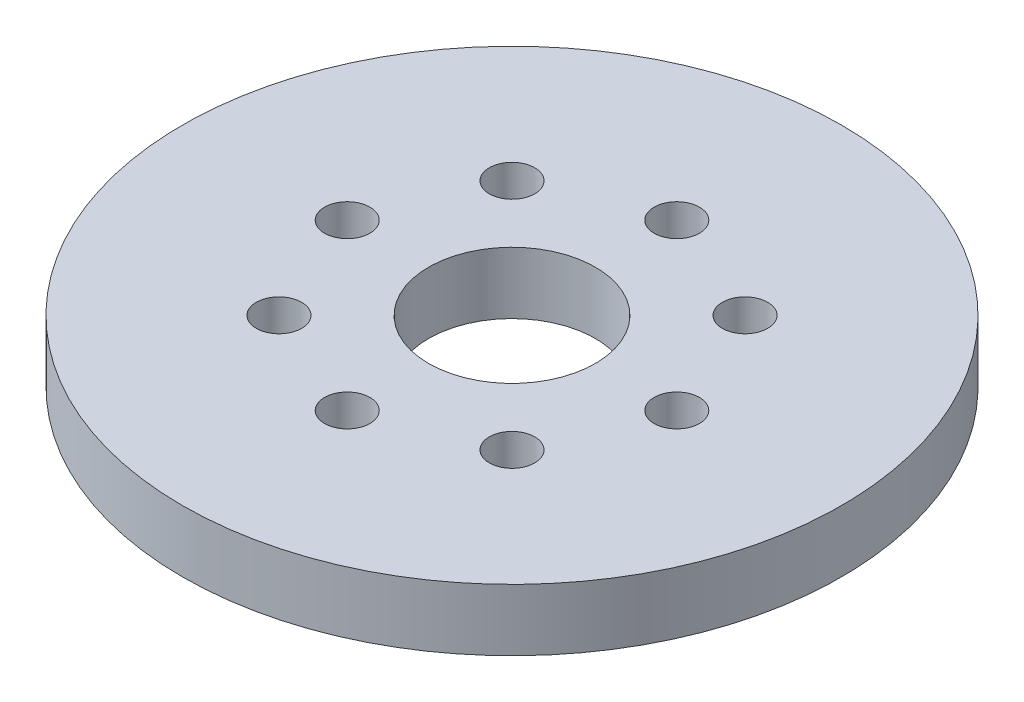
ISO-10303-21;
HEADER;
FILE_DESCRIPTION(('STEP AP214'),'2;1');
FILE_NAME('part.step','',(''),(''),'','','');
FILE_SCHEMA(('AUTOMOTIVE_DESIGN { 1 0 10303 214 1 1 1 1 }'));
ENDSEC;
DATA;
#1=APPLICATION_CONTEXT('core data for automotive mechanical design processes');
#2=APPLICATION_PROTOCOL_DEFINITION('international standard','automotive_design',2000,#1);
#3=PRODUCT_CONTEXT('',#1,'mechanical');
#4=PRODUCT('Part','Part','',(#3));
#5=PRODUCT_RELATED_PRODUCT_CATEGORY('part','',(#4));
#6=PRODUCT_DEFINITION_FORMATION('','',#4);
#7=PRODUCT_DEFINITION_CONTEXT('part definition',#1,'design');
#8=PRODUCT_DEFINITION('design','',#6,#7);
#9=PRODUCT_DEFINITION_SHAPE('','',#8);
#10=(LENGTH_UNIT() NAMED_UNIT(*) SI_UNIT(.MILLI.,.METRE.));
#11=(NAMED_UNIT(*) PLANE_ANGLE_UNIT() SI_UNIT($,.RADIAN.));
#12=(NAMED_UNIT(*) SI_UNIT($,.STERADIAN.) SOLID_ANGLE_UNIT());
#13=UNCERTAINTY_MEASURE_WITH_UNIT(LENGTH_MEASURE(1.E-05),#10,'distance_accuracy_value','');
#14=(GEOMETRIC_REPRESENTATION_CONTEXT(3) GLOBAL_UNCERTAINTY_ASSIGNED_CONTEXT((#13)) GLOBAL_UNIT_ASSIGNED_CONTEXT((#10,
#11,#12)) REPRESENTATION_CONTEXT('',''));
#15=CARTESIAN_POINT('',(0.,0.,0.));
#16=DIRECTION('',(0.,0.,1.));
#17=DIRECTION('',(1.,0.,0.));
#18=AXIS2_PLACEMENT_3D('',#15,#16,#17);
#19=CARTESIAN_POINT('',(0.,3.,0.));
#20=DIRECTION('',(0.,1.,0.));
#21=DIRECTION('',(0.,0.,1.));
#22=AXIS2_PLACEMENT_3D('',#19,#20,#21);
#23=PLANE('',#22);
#24=CARTESIAN_POINT('',(-8.,3.,0.));
#25=DIRECTION('',(0.,1.,0.));
#26=DIRECTION('',(0.,0.,1.));
#27=AXIS2_PLACEMENT_3D('',#24,#25,#26);
#28=CIRCLE('',#27,1.1);
#29=CARTESIAN_POINT('',(-8.,3.,1.09999999999992));
#30=VERTEX_POINT('',#29);
#31=EDGE_CURVE('E82',#30,#30,#28,.T.);
#32=ORIENTED_EDGE('',*,*,#31,.F.);
#33=EDGE_LOOP('',(#32));
#34=FACE_BOUND('',#33,.T.);
#35=CARTESIAN_POINT('',(0.,3.,8.));
#36=DIRECTION('',(0.,1.,0.));
#37=DIRECTION('',(0.,0.,1.));
#38=AXIS2_PLACEMENT_3D('',#35,#36,#37);
#39=CIRCLE('',#38,1.1);
#40=CARTESIAN_POINT('',(0.,3.,9.1));
#41=VERTEX_POINT('',#40);
#42=EDGE_CURVE('E70',#41,#41,#39,.T.);
#43=ORIENTED_EDGE('',*,*,#42,.F.);
#44=EDGE_LOOP('',(#43));
#45=FACE_BOUND('',#44,.T.);
#46=CARTESIAN_POINT('',(8.,3.,0.));
#47=DIRECTION('',(0.,1.,0.));
#48=DIRECTION('',(0.,0.,1.));
#49=AXIS2_PLACEMENT_3D('',#46,#47,#48);
#50=CIRCLE('',#49,1.1);
#51=CARTESIAN_POINT('',(8.,3.,1.10000000000003));
#52=VERTEX_POINT('',#51);
#53=EDGE_CURVE('E58',#52,#52,#50,.T.);
#54=ORIENTED_EDGE('',*,*,#53,.F.);
#55=EDGE_LOOP('',(#54));
#56=FACE_BOUND('',#55,.T.);
#57=CARTESIAN_POINT('',(0.,3.,-8.));
#58=DIRECTION('',(0.,1.,0.));
#59=DIRECTION('',(0.,0.,1.));
#60=AXIS2_PLACEMENT_3D('',#57,#58,#59);
#61=CIRCLE('',#60,1.1);
#62=CARTESIAN_POINT('',(0.,3.,-6.9));
#63=VERTEX_POINT('',#62);
#64=EDGE_CURVE('E46',#63,#63,#61,.T.);
#65=ORIENTED_EDGE('',*,*,#64,.F.);
#66=EDGE_LOOP('',(#65));
#67=FACE_BOUND('',#66,.T.);
#68=CARTESIAN_POINT('',(0.,3.,0.));
#69=DIRECTION('',(0.,1.,0.));
#70=DIRECTION('',(0.,0.,1.));
#71=AXIS2_PLACEMENT_3D('',#68,#69,#70);
#72=CIRCLE('',#71,16.);
#73=CARTESIAN_POINT('',(0.,3.,16.));
#74=VERTEX_POINT('',#73);
#75=EDGE_CURVE('E10',#74,#74,#72,.T.);
#76=ORIENTED_EDGE('',*,*,#75,.T.);
#77=EDGE_LOOP('',(#76));
#78=FACE_BOUND('',#77,.T.);
#79=CARTESIAN_POINT('',(0.,3.,0.));
#80=DIRECTION('',(0.,1.,0.));
#81=DIRECTION('',(0.,0.,1.));
#82=AXIS2_PLACEMENT_3D('',#79,#80,#81);
#83=CIRCLE('',#82,4.05);
#84=CARTESIAN_POINT('',(0.,3.,4.05));
#85=VERTEX_POINT('',#84);
#86=EDGE_CURVE('E41',#85,#85,#83,.T.);
#87=ORIENTED_EDGE('',*,*,#86,.F.);
#88=EDGE_LOOP('',(#87));
#89=FACE_BOUND('',#88,.T.);
#90=CARTESIAN_POINT('',(5.65685424949239,3.,-5.65685424949237));
#91=DIRECTION('',(0.,1.,0.));
#92=DIRECTION('',(0.,0.,1.));
#93=AXIS2_PLACEMENT_3D('',#90,#91,#92);
#94=CIRCLE('',#93,1.1);
#95=CARTESIAN_POINT('',(5.65685424949239,3.,-4.55685424949237));
#96=VERTEX_POINT('',#95);
#97=EDGE_CURVE('E52',#96,#96,#94,.T.);
#98=ORIENTED_EDGE('',*,*,#97,.F.);
#99=EDGE_LOOP('',(#98));
#100=FACE_BOUND('',#99,.T.);
#101=CARTESIAN_POINT('',(5.65685424949235,3.,5.65685424949241));
#102=DIRECTION('',(0.,1.,0.));
#103=DIRECTION('',(0.,0.,1.));
#104=AXIS2_PLACEMENT_3D('',#101,#102,#103);
#105=CIRCLE('',#104,1.1);
#106=CARTESIAN_POINT('',(5.65685424949235,3.,6.75685424949241));
#107=VERTEX_POINT('',#106);
#108=EDGE_CURVE('E64',#107,#107,#105,.T.);
#109=ORIENTED_EDGE('',*,*,#108,.F.);
#110=EDGE_LOOP('',(#109));
#111=FACE_BOUND('',#110,.T.);
#112=CARTESIAN_POINT('',(-5.65685424949243,3.,5.65685424949233));
#113=DIRECTION('',(0.,1.,0.));
#114=DIRECTION('',(0.,0.,1.));
#115=AXIS2_PLACEMENT_3D('',#112,#113,#114);
#116=CIRCLE('',#115,1.1);
#117=CARTESIAN_POINT('',(-5.65685424949243,3.,6.75685424949233));
#118=VERTEX_POINT('',#117);
#119=EDGE_CURVE('E76',#118,#118,#116,.T.);
#120=ORIENTED_EDGE('',*,*,#119,.F.);
#121=EDGE_LOOP('',(#120));
#122=FACE_BOUND('',#121,.T.);
#123=CARTESIAN_POINT('',(-5.65685424949231,3.,-5.65685424949245));
#124=DIRECTION('',(0.,1.,0.));
#125=DIRECTION('',(0.,0.,1.));
#126=AXIS2_PLACEMENT_3D('',#123,#124,#125);
#127=CIRCLE('',#126,1.1);
#128=CARTESIAN_POINT('',(-5.65685424949231,3.,-4.55685424949245));
#129=VERTEX_POINT('',#128);
#130=EDGE_CURVE('E88',#129,#129,#127,.T.);
#131=ORIENTED_EDGE('',*,*,#130,.F.);
#132=EDGE_LOOP('',(#131));
#133=FACE_BOUND('',#132,.T.);
#134=ADVANCED_FACE('F30',(#34,#45,#56,#67,#78,#89,#100,#111,#122,#133),#23,.T.);
#135=CARTESIAN_POINT('',(0.,0.,0.));
#136=DIRECTION('',(0.,1.,0.));
#137=DIRECTION('',(0.,0.,1.));
#138=AXIS2_PLACEMENT_3D('',#135,#136,#137);
#139=PLANE('',#138);
#140=CARTESIAN_POINT('',(-8.,0.,0.));
#141=DIRECTION('',(0.,1.,0.));
#142=DIRECTION('',(0.,0.,1.));
#143=AXIS2_PLACEMENT_3D('',#140,#141,#142);
#144=CIRCLE('',#143,1.1);
#145=CARTESIAN_POINT('',(-8.,0.,1.09999999999992));
#146=VERTEX_POINT('',#145);
#147=EDGE_CURVE('E85',#146,#146,#144,.T.);
#148=ORIENTED_EDGE('',*,*,#147,.T.);
#149=EDGE_LOOP('',(#148));
#150=FACE_BOUND('',#149,.T.);
#151=CARTESIAN_POINT('',(0.,0.,8.));
#152=DIRECTION('',(0.,1.,0.));
#153=DIRECTION('',(0.,0.,1.));
#154=AXIS2_PLACEMENT_3D('',#151,#152,#153);
#155=CIRCLE('',#154,1.1);
#156=CARTESIAN_POINT('',(0.,0.,9.1));
#157=VERTEX_POINT('',#156);
#158=EDGE_CURVE('E73',#157,#157,#155,.T.);
#159=ORIENTED_EDGE('',*,*,#158,.T.);
#160=EDGE_LOOP('',(#159));
#161=FACE_BOUND('',#160,.T.);
#162=CARTESIAN_POINT('',(8.,0.,0.));
#163=DIRECTION('',(0.,1.,0.));
#164=DIRECTION('',(0.,0.,1.));
#165=AXIS2_PLACEMENT_3D('',#162,#163,#164);
#166=CIRCLE('',#165,1.1);
#167=CARTESIAN_POINT('',(8.,0.,1.10000000000003));
#168=VERTEX_POINT('',#167);
#169=EDGE_CURVE('E61',#168,#168,#166,.T.);
#170=ORIENTED_EDGE('',*,*,#169,.T.);
#171=EDGE_LOOP('',(#170));
#172=FACE_BOUND('',#171,.T.);
#173=CARTESIAN_POINT('',(0.,0.,-8.));
#174=DIRECTION('',(0.,1.,0.));
#175=DIRECTION('',(0.,0.,1.));
#176=AXIS2_PLACEMENT_3D('',#173,#174,#175);
#177=CIRCLE('',#176,1.1);
#178=CARTESIAN_POINT('',(0.,0.,-6.9));
#179=VERTEX_POINT('',#178);
#180=EDGE_CURVE('E49',#179,#179,#177,.T.);
#181=ORIENTED_EDGE('',*,*,#180,.T.);
#182=EDGE_LOOP('',(#181));
#183=FACE_BOUND('',#182,.T.);
#184=CARTESIAN_POINT('',(0.,0.,0.));
#185=DIRECTION('',(0.,1.,0.));
#186=DIRECTION('',(0.,0.,1.));
#187=AXIS2_PLACEMENT_3D('',#184,#185,#186);
#188=CIRCLE('',#187,16.);
#189=CARTESIAN_POINT('',(0.,0.,16.));
#190=VERTEX_POINT('',#189);
#191=EDGE_CURVE('E34',#190,#190,#188,.T.);
#192=ORIENTED_EDGE('',*,*,#191,.F.);
#193=EDGE_LOOP('',(#192));
#194=FACE_BOUND('',#193,.T.);
#195=CARTESIAN_POINT('',(0.,0.,0.));
#196=DIRECTION('',(0.,1.,0.));
#197=DIRECTION('',(0.,0.,1.));
#198=AXIS2_PLACEMENT_3D('',#195,#196,#197);
#199=CIRCLE('',#198,4.05);
#200=CARTESIAN_POINT('',(0.,0.,4.05));
#201=VERTEX_POINT('',#200);
#202=EDGE_CURVE('E43',#201,#201,#199,.T.);
#203=ORIENTED_EDGE('',*,*,#202,.T.);
#204=EDGE_LOOP('',(#203));
#205=FACE_BOUND('',#204,.T.);
#206=CARTESIAN_POINT('',(5.65685424949239,0.,-5.65685424949237));
#207=DIRECTION('',(0.,1.,0.));
#208=DIRECTION('',(0.,0.,1.));
#209=AXIS2_PLACEMENT_3D('',#206,#207,#208);
#210=CIRCLE('',#209,1.1);
#211=CARTESIAN_POINT('',(5.65685424949239,0.,-4.55685424949237));
#212=VERTEX_POINT('',#211);
#213=EDGE_CURVE('E55',#212,#212,#210,.T.);
#214=ORIENTED_EDGE('',*,*,#213,.T.);
#215=EDGE_LOOP('',(#214));
#216=FACE_BOUND('',#215,.T.);
#217=CARTESIAN_POINT('',(5.65685424949235,0.,5.65685424949241));
#218=DIRECTION('',(0.,1.,0.));
#219=DIRECTION('',(0.,0.,1.));
#220=AXIS2_PLACEMENT_3D('',#217,#218,#219);
#221=CIRCLE('',#220,1.1);
#222=CARTESIAN_POINT('',(5.65685424949235,0.,6.75685424949241));
#223=VERTEX_POINT('',#222);
#224=EDGE_CURVE('E67',#223,#223,#221,.T.);
#225=ORIENTED_EDGE('',*,*,#224,.T.);
#226=EDGE_LOOP('',(#225));
#227=FACE_BOUND('',#226,.T.);
#228=CARTESIAN_POINT('',(-5.65685424949243,0.,5.65685424949233));
#229=DIRECTION('',(0.,1.,0.));
#230=DIRECTION('',(0.,0.,1.));
#231=AXIS2_PLACEMENT_3D('',#228,#229,#230);
#232=CIRCLE('',#231,1.1);
#233=CARTESIAN_POINT('',(-5.65685424949243,0.,6.75685424949233));
#234=VERTEX_POINT('',#233);
#235=EDGE_CURVE('E79',#234,#234,#232,.T.);
#236=ORIENTED_EDGE('',*,*,#235,.T.);
#237=EDGE_LOOP('',(#236));
#238=FACE_BOUND('',#237,.T.);
#239=CARTESIAN_POINT('',(-5.65685424949231,0.,-5.65685424949245));
#240=DIRECTION('',(0.,1.,0.));
#241=DIRECTION('',(0.,0.,1.));
#242=AXIS2_PLACEMENT_3D('',#239,#240,#241);
#243=CIRCLE('',#242,1.1);
#244=CARTESIAN_POINT('',(-5.65685424949231,0.,-4.55685424949245));
#245=VERTEX_POINT('',#244);
#246=EDGE_CURVE('E91',#245,#245,#243,.T.);
#247=ORIENTED_EDGE('',*,*,#246,.T.);
#248=EDGE_LOOP('',(#247));
#249=FACE_BOUND('',#248,.T.);
#250=ADVANCED_FACE('F101',(#150,#161,#172,#183,#194,#205,#216,#227,#238,#249),#139,.F.);
#251=CARTESIAN_POINT('',(0.,3.,0.));
#252=DIRECTION('',(0.,-1.,0.));
#253=DIRECTION('',(0.,0.,-1.));
#254=AXIS2_PLACEMENT_3D('',#251,#252,#253);
#255=CYLINDRICAL_SURFACE('',#254,16.);
#256=ORIENTED_EDGE('',*,*,#75,.F.);
#257=EDGE_LOOP('',(#256));
#258=FACE_BOUND('',#257,.T.);
#259=ORIENTED_EDGE('',*,*,#191,.T.);
#260=EDGE_LOOP('',(#259));
#261=FACE_BOUND('',#260,.T.);
#262=ADVANCED_FACE('F32',(#258,#261),#255,.T.);
#263=CARTESIAN_POINT('',(0.,3.,0.));
#264=DIRECTION('',(0.,-1.,0.));
#265=DIRECTION('',(0.,0.,-1.));
#266=AXIS2_PLACEMENT_3D('',#263,#264,#265);
#267=CYLINDRICAL_SURFACE('',#266,4.05);
#268=ORIENTED_EDGE('',*,*,#86,.T.);
#269=EDGE_LOOP('',(#268));
#270=FACE_BOUND('',#269,.T.);
#271=ORIENTED_EDGE('',*,*,#202,.F.);
#272=EDGE_LOOP('',(#271));
#273=FACE_BOUND('',#272,.T.);
#274=ADVANCED_FACE('F111',(#270,#273),#267,.F.);
#275=CARTESIAN_POINT('',(0.,3.,-8.));
#276=DIRECTION('',(0.,-1.,0.));
#277=DIRECTION('',(0.,0.,-1.));
#278=AXIS2_PLACEMENT_3D('',#275,#276,#277);
#279=CYLINDRICAL_SURFACE('',#278,1.1);
#280=ORIENTED_EDGE('',*,*,#64,.T.);
#281=EDGE_LOOP('',(#280));
#282=FACE_BOUND('',#281,.T.);
#283=ORIENTED_EDGE('',*,*,#180,.F.);
#284=EDGE_LOOP('',(#283));
#285=FACE_BOUND('',#284,.T.);
#286=ADVANCED_FACE('F114',(#282,#285),#279,.F.);
#287=CARTESIAN_POINT('',(5.65685424949239,3.,-5.65685424949237));
#288=DIRECTION('',(0.,-1.,0.));
#289=DIRECTION('',(0.,0.,-1.));
#290=AXIS2_PLACEMENT_3D('',#287,#288,#289);
#291=CYLINDRICAL_SURFACE('',#290,1.1);
#292=ORIENTED_EDGE('',*,*,#97,.T.);
#293=EDGE_LOOP('',(#292));
#294=FACE_BOUND('',#293,.T.);
#295=ORIENTED_EDGE('',*,*,#213,.F.);
#296=EDGE_LOOP('',(#295));
#297=FACE_BOUND('',#296,.T.);
#298=ADVANCED_FACE('F118',(#294,#297),#291,.F.);
#299=CARTESIAN_POINT('',(8.,3.,0.));
#300=DIRECTION('',(0.,-1.,0.));
#301=DIRECTION('',(0.,0.,-1.));
#302=AXIS2_PLACEMENT_3D('',#299,#300,#301);
#303=CYLINDRICAL_SURFACE('',#302,1.1);
#304=ORIENTED_EDGE('',*,*,#53,.T.);
#305=EDGE_LOOP('',(#304));
#306=FACE_BOUND('',#305,.T.);
#307=ORIENTED_EDGE('',*,*,#169,.F.);
#308=EDGE_LOOP('',(#307));
#309=FACE_BOUND('',#308,.T.);
#310=ADVANCED_FACE('F122',(#306,#309),#303,.F.);
#311=CARTESIAN_POINT('',(5.65685424949235,3.,5.65685424949241));
#312=DIRECTION('',(0.,-1.,0.));
#313=DIRECTION('',(0.,0.,-1.));
#314=AXIS2_PLACEMENT_3D('',#311,#312,#313);
#315=CYLINDRICAL_SURFACE('',#314,1.1);
#316=ORIENTED_EDGE('',*,*,#108,.T.);
#317=EDGE_LOOP('',(#316));
#318=FACE_BOUND('',#317,.T.);
#319=ORIENTED_EDGE('',*,*,#224,.F.);
#320=EDGE_LOOP('',(#319));
#321=FACE_BOUND('',#320,.T.);
#322=ADVANCED_FACE('F126',(#318,#321),#315,.F.);
#323=CARTESIAN_POINT('',(0.,3.,8.));
#324=DIRECTION('',(0.,-1.,0.));
#325=DIRECTION('',(0.,0.,-1.));
#326=AXIS2_PLACEMENT_3D('',#323,#324,#325);
#327=CYLINDRICAL_SURFACE('',#326,1.1);
#328=ORIENTED_EDGE('',*,*,#42,.T.);
#329=EDGE_LOOP('',(#328));
#330=FACE_BOUND('',#329,.T.);
#331=ORIENTED_EDGE('',*,*,#158,.F.);
#332=EDGE_LOOP('',(#331));
#333=FACE_BOUND('',#332,.T.);
#334=ADVANCED_FACE('F130',(#330,#333),#327,.F.);
#335=CARTESIAN_POINT('',(-5.65685424949243,3.,5.65685424949233));
#336=DIRECTION('',(0.,-1.,0.));
#337=DIRECTION('',(0.,0.,-1.));
#338=AXIS2_PLACEMENT_3D('',#335,#336,#337);
#339=CYLINDRICAL_SURFACE('',#338,1.1);
#340=ORIENTED_EDGE('',*,*,#119,.T.);
#341=EDGE_LOOP('',(#340));
#342=FACE_BOUND('',#341,.T.);
#343=ORIENTED_EDGE('',*,*,#235,.F.);
#344=EDGE_LOOP('',(#343));
#345=FACE_BOUND('',#344,.T.);
#346=ADVANCED_FACE('F134',(#342,#345),#339,.F.);
#347=CARTESIAN_POINT('',(-8.,3.,0.));
#348=DIRECTION('',(0.,-1.,0.));
#349=DIRECTION('',(0.,0.,-1.));
#350=AXIS2_PLACEMENT_3D('',#347,#348,#349);
#351=CYLINDRICAL_SURFACE('',#350,1.1);
#352=ORIENTED_EDGE('',*,*,#31,.T.);
#353=EDGE_LOOP('',(#352));
#354=FACE_BOUND('',#353,.T.);
#355=ORIENTED_EDGE('',*,*,#147,.F.);
#356=EDGE_LOOP('',(#355));
#357=FACE_BOUND('',#356,.T.);
#358=ADVANCED_FACE('F138',(#354,#357),#351,.F.);
#359=CARTESIAN_POINT('',(-5.65685424949231,3.,-5.65685424949245));
#360=DIRECTION('',(0.,-1.,0.));
#361=DIRECTION('',(0.,0.,-1.));
#362=AXIS2_PLACEMENT_3D('',#359,#360,#361);
#363=CYLINDRICAL_SURFACE('',#362,1.1);
#364=ORIENTED_EDGE('',*,*,#130,.T.);
#365=EDGE_LOOP('',(#364));
#366=FACE_BOUND('',#365,.T.);
#367=ORIENTED_EDGE('',*,*,#246,.F.);
#368=EDGE_LOOP('',(#367));
#369=FACE_BOUND('',#368,.T.);
#370=ADVANCED_FACE('F97',(#366,#369),#363,.F.);
#371=CLOSED_SHELL('',(#134,#250,#262,#274,#286,#298,#310,#322,#334,#346,#358,#370));
#372=MANIFOLD_SOLID_BREP('B2',#371);
#373=ADVANCED_BREP_SHAPE_REPRESENTATION('',(#18,#372),#14);
#374=SHAPE_DEFINITION_REPRESENTATION(#9,#373);
ENDSEC;
END-ISO-10303-21;
